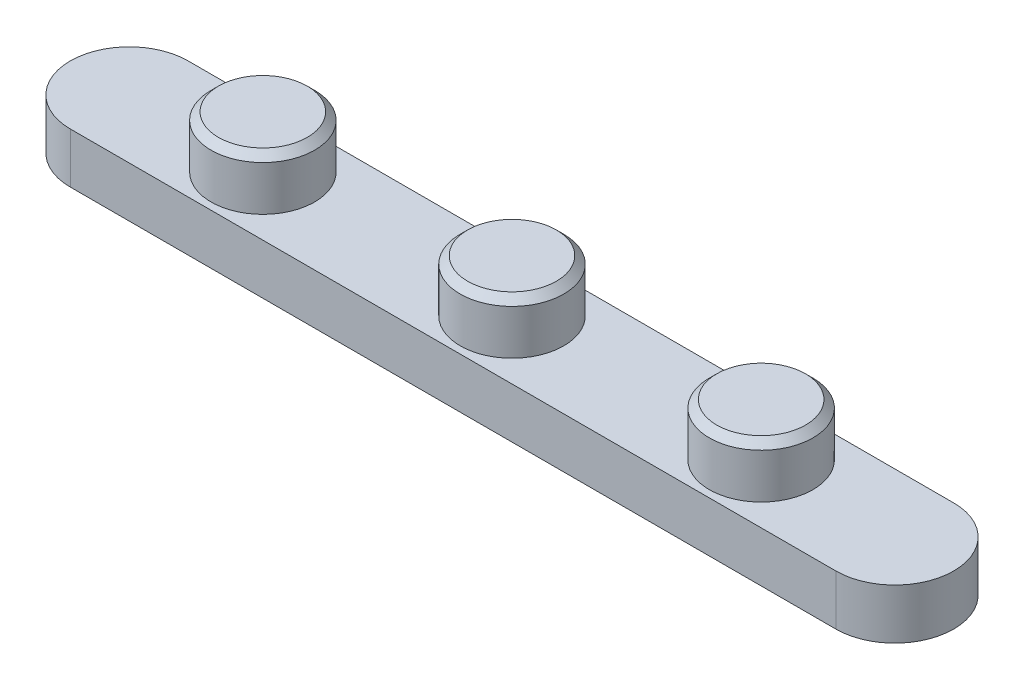
ISO-10303-21;
HEADER;
FILE_DESCRIPTION(('STEP AP214'),'2;1');
FILE_NAME('part.step','',(''),(''),'','','');
FILE_SCHEMA(('AUTOMOTIVE_DESIGN { 1 0 10303 214 1 1 1 1 }'));
ENDSEC;
DATA;
#1=APPLICATION_CONTEXT('core data for automotive mechanical design processes');
#2=APPLICATION_PROTOCOL_DEFINITION('international standard','automotive_design',2000,#1);
#3=PRODUCT_CONTEXT('',#1,'mechanical');
#4=PRODUCT('Part','Part','',(#3));
#5=PRODUCT_RELATED_PRODUCT_CATEGORY('part','',(#4));
#6=PRODUCT_DEFINITION_FORMATION('','',#4);
#7=PRODUCT_DEFINITION_CONTEXT('part definition',#1,'design');
#8=PRODUCT_DEFINITION('design','',#6,#7);
#9=PRODUCT_DEFINITION_SHAPE('','',#8);
#10=(LENGTH_UNIT() NAMED_UNIT(*) SI_UNIT(.MILLI.,.METRE.));
#11=(NAMED_UNIT(*) PLANE_ANGLE_UNIT() SI_UNIT($,.RADIAN.));
#12=(NAMED_UNIT(*) SI_UNIT($,.STERADIAN.) SOLID_ANGLE_UNIT());
#13=UNCERTAINTY_MEASURE_WITH_UNIT(LENGTH_MEASURE(1.E-05),#10,'distance_accuracy_value','');
#14=(GEOMETRIC_REPRESENTATION_CONTEXT(3) GLOBAL_UNCERTAINTY_ASSIGNED_CONTEXT((#13)) GLOBAL_UNIT_ASSIGNED_CONTEXT((#10,
#11,#12)) REPRESENTATION_CONTEXT('',''));
#15=CARTESIAN_POINT('',(0.,0.,0.));
#16=DIRECTION('',(0.,0.,1.));
#17=DIRECTION('',(1.,0.,0.));
#18=AXIS2_PLACEMENT_3D('',#15,#16,#17);
#19=CARTESIAN_POINT('',(-25.855,3.4,2.35888997018641E-13));
#20=DIRECTION('',(0.,-1.,0.));
#21=DIRECTION('',(0.,0.,-1.));
#22=AXIS2_PLACEMENT_3D('',#19,#20,#21);
#23=CYLINDRICAL_SURFACE('',#22,3.98000000000024);
#24=CARTESIAN_POINT('',(-25.855,0.,2.35888997018641E-13));
#25=DIRECTION('',(0.,1.,0.));
#26=DIRECTION('',(0.,0.,1.));
#27=AXIS2_PLACEMENT_3D('',#24,#25,#26);
#28=CIRCLE('',#27,3.98000000000024);
#29=CARTESIAN_POINT('',(-25.855,0.,-3.98000000000024));
#30=VERTEX_POINT('',#29);
#31=CARTESIAN_POINT('',(-25.855,0.,3.98000000000024));
#32=VERTEX_POINT('',#31);
#33=EDGE_CURVE('E114',#30,#32,#28,.T.);
#34=ORIENTED_EDGE('',*,*,#33,.T.);
#35=DIRECTION('',(0.,-1.,0.));
#36=VECTOR('',#35,1.);
#37=CARTESIAN_POINT('',(-25.855,3.4,3.98000000000024));
#38=LINE('',#37,#36);
#39=CARTESIAN_POINT('',(-25.855,3.4,3.98000000000024));
#40=VERTEX_POINT('',#39);
#41=EDGE_CURVE('E106',#40,#32,#38,.T.);
#42=ORIENTED_EDGE('',*,*,#41,.F.);
#43=CARTESIAN_POINT('',(-25.855,3.4,2.35888997018641E-13));
#44=DIRECTION('',(0.,1.,0.));
#45=DIRECTION('',(0.,0.,1.));
#46=AXIS2_PLACEMENT_3D('',#43,#44,#45);
#47=CIRCLE('',#46,3.98000000000024);
#48=CARTESIAN_POINT('',(-25.855,3.4,-3.98000000000024));
#49=VERTEX_POINT('',#48);
#50=EDGE_CURVE('E97',#49,#40,#47,.T.);
#51=ORIENTED_EDGE('',*,*,#50,.F.);
#52=DIRECTION('',(0.,-1.,0.));
#53=VECTOR('',#52,1.);
#54=CARTESIAN_POINT('',(-25.855,3.4,-3.98000000000024));
#55=LINE('',#54,#53);
#56=EDGE_CURVE('E63',#49,#30,#55,.T.);
#57=ORIENTED_EDGE('',*,*,#56,.T.);
#58=EDGE_LOOP('',(#34,#42,#51,#57));
#59=FACE_BOUND('',#58,.T.);
#60=ADVANCED_FACE('F45',(#59),#23,.T.);
#61=CARTESIAN_POINT('',(-25.855,3.4,3.98000000000024));
#62=DIRECTION('',(0.,0.,-1.));
#63=DIRECTION('',(-1.,0.,0.));
#64=AXIS2_PLACEMENT_3D('',#61,#62,#63);
#65=PLANE('',#64);
#66=DIRECTION('',(1.,0.,0.));
#67=VECTOR('',#66,1.);
#68=CARTESIAN_POINT('',(-25.855,0.,3.98000000000024));
#69=LINE('',#68,#67);
#70=CARTESIAN_POINT('',(25.855,0.,3.98000000000024));
#71=VERTEX_POINT('',#70);
#72=EDGE_CURVE('E103',#32,#71,#69,.T.);
#73=ORIENTED_EDGE('',*,*,#72,.T.);
#74=DIRECTION('',(0.,-1.,0.));
#75=VECTOR('',#74,1.);
#76=CARTESIAN_POINT('',(25.855,3.4,3.98000000000024));
#77=LINE('',#76,#75);
#78=CARTESIAN_POINT('',(25.855,3.4,3.98000000000024));
#79=VERTEX_POINT('',#78);
#80=EDGE_CURVE('E101',#79,#71,#77,.T.);
#81=ORIENTED_EDGE('',*,*,#80,.F.);
#82=DIRECTION('',(1.,0.,0.));
#83=VECTOR('',#82,1.);
#84=CARTESIAN_POINT('',(-25.855,3.4,3.98000000000024));
#85=LINE('',#84,#83);
#86=EDGE_CURVE('E90',#40,#79,#85,.T.);
#87=ORIENTED_EDGE('',*,*,#86,.F.);
#88=ORIENTED_EDGE('',*,*,#41,.T.);
#89=EDGE_LOOP('',(#73,#81,#87,#88));
#90=FACE_BOUND('',#89,.T.);
#91=ADVANCED_FACE('F102',(#90),#65,.F.);
#92=CARTESIAN_POINT('',(25.855,3.4,2.35888997018641E-13));
#93=DIRECTION('',(0.,-1.,0.));
#94=DIRECTION('',(0.,0.,-1.));
#95=AXIS2_PLACEMENT_3D('',#92,#93,#94);
#96=CYLINDRICAL_SURFACE('',#95,3.98000000000024);
#97=CARTESIAN_POINT('',(25.855,0.,2.35888997018641E-13));
#98=DIRECTION('',(0.,1.,0.));
#99=DIRECTION('',(0.,0.,1.));
#100=AXIS2_PLACEMENT_3D('',#97,#98,#99);
#101=CIRCLE('',#100,3.98000000000024);
#102=CARTESIAN_POINT('',(25.855,0.,-3.98));
#103=VERTEX_POINT('',#102);
#104=EDGE_CURVE('E118',#71,#103,#101,.T.);
#105=ORIENTED_EDGE('',*,*,#104,.T.);
#106=DIRECTION('',(0.,-1.,0.));
#107=VECTOR('',#106,1.);
#108=CARTESIAN_POINT('',(25.855,3.4,-3.98));
#109=LINE('',#108,#107);
#110=CARTESIAN_POINT('',(25.855,3.4,-3.98));
#111=VERTEX_POINT('',#110);
#112=EDGE_CURVE('E78',#111,#103,#109,.T.);
#113=ORIENTED_EDGE('',*,*,#112,.F.);
#114=CARTESIAN_POINT('',(25.855,3.4,2.35888997018641E-13));
#115=DIRECTION('',(0.,1.,0.));
#116=DIRECTION('',(0.,0.,1.));
#117=AXIS2_PLACEMENT_3D('',#114,#115,#116);
#118=CIRCLE('',#117,3.98000000000024);
#119=EDGE_CURVE('E96',#79,#111,#118,.T.);
#120=ORIENTED_EDGE('',*,*,#119,.F.);
#121=ORIENTED_EDGE('',*,*,#80,.T.);
#122=EDGE_LOOP('',(#105,#113,#120,#121));
#123=FACE_BOUND('',#122,.T.);
#124=ADVANCED_FACE('F108',(#123),#96,.T.);
#125=CARTESIAN_POINT('',(-25.855,3.4,-3.98000000000024));
#126=DIRECTION('',(0.,0.,-1.));
#127=DIRECTION('',(-1.,0.,0.));
#128=AXIS2_PLACEMENT_3D('',#125,#126,#127);
#129=PLANE('',#128);
#130=DIRECTION('',(1.,0.,0.));
#131=VECTOR('',#130,1.);
#132=CARTESIAN_POINT('',(-25.855,0.,-3.98000000000024));
#133=LINE('',#132,#131);
#134=EDGE_CURVE('E120',#30,#103,#133,.T.);
#135=ORIENTED_EDGE('',*,*,#134,.F.);
#136=ORIENTED_EDGE('',*,*,#56,.F.);
#137=DIRECTION('',(1.,0.,0.));
#138=VECTOR('',#137,1.);
#139=CARTESIAN_POINT('',(-25.855,3.4,-3.98000000000024));
#140=LINE('',#139,#138);
#141=EDGE_CURVE('E109',#49,#111,#140,.T.);
#142=ORIENTED_EDGE('',*,*,#141,.T.);
#143=ORIENTED_EDGE('',*,*,#112,.T.);
#144=EDGE_LOOP('',(#135,#136,#142,#143));
#145=FACE_BOUND('',#144,.T.);
#146=ADVANCED_FACE('F198',(#145),#129,.T.);
#147=CARTESIAN_POINT('',(-25.855,3.4,2.35888997018641E-13));
#148=DIRECTION('',(0.,1.,0.));
#149=DIRECTION('',(0.,0.,1.));
#150=AXIS2_PLACEMENT_3D('',#147,#148,#149);
#151=PLANE('',#150);
#152=CARTESIAN_POINT('',(0.,3.4,0.));
#153=DIRECTION('',(0.,1.,0.));
#154=DIRECTION('',(0.,0.,1.));
#155=AXIS2_PLACEMENT_3D('',#152,#153,#154);
#156=CIRCLE('',#155,3.5);
#157=CARTESIAN_POINT('',(0.,3.4,-3.5));
#158=VERTEX_POINT('',#157);
#159=EDGE_CURVE('E333',#158,#158,#156,.F.);
#160=ORIENTED_EDGE('',*,*,#159,.T.);
#161=EDGE_LOOP('',(#160));
#162=FACE_BOUND('',#161,.T.);
#163=CARTESIAN_POINT('',(16.8275,3.4,0.));
#164=DIRECTION('',(0.,1.,0.));
#165=DIRECTION('',(0.,0.,1.));
#166=AXIS2_PLACEMENT_3D('',#163,#164,#165);
#167=CIRCLE('',#166,3.5);
#168=CARTESIAN_POINT('',(16.8275,3.4,-3.5));
#169=VERTEX_POINT('',#168);
#170=EDGE_CURVE('E330',#169,#169,#167,.F.);
#171=ORIENTED_EDGE('',*,*,#170,.T.);
#172=EDGE_LOOP('',(#171));
#173=FACE_BOUND('',#172,.T.);
#174=CARTESIAN_POINT('',(-16.8275,3.4,0.));
#175=DIRECTION('',(0.,1.,0.));
#176=DIRECTION('',(0.,0.,1.));
#177=AXIS2_PLACEMENT_3D('',#174,#175,#176);
#178=CIRCLE('',#177,3.5);
#179=CARTESIAN_POINT('',(-16.8275,3.4,-3.5));
#180=VERTEX_POINT('',#179);
#181=EDGE_CURVE('E116',#180,#180,#178,.F.);
#182=ORIENTED_EDGE('',*,*,#181,.T.);
#183=EDGE_LOOP('',(#182));
#184=FACE_BOUND('',#183,.T.);
#185=ORIENTED_EDGE('',*,*,#50,.T.);
#186=ORIENTED_EDGE('',*,*,#86,.T.);
#187=ORIENTED_EDGE('',*,*,#119,.T.);
#188=ORIENTED_EDGE('',*,*,#141,.F.);
#189=EDGE_LOOP('',(#185,#186,#187,#188));
#190=FACE_BOUND('',#189,.T.);
#191=ADVANCED_FACE('F93',(#162,#173,#184,#190),#151,.T.);
#192=CARTESIAN_POINT('',(-25.855,0.,2.35888997018641E-13));
#193=DIRECTION('',(0.,1.,0.));
#194=DIRECTION('',(0.,0.,1.));
#195=AXIS2_PLACEMENT_3D('',#192,#193,#194);
#196=PLANE('',#195);
#197=ORIENTED_EDGE('',*,*,#33,.F.);
#198=ORIENTED_EDGE('',*,*,#134,.T.);
#199=ORIENTED_EDGE('',*,*,#104,.F.);
#200=ORIENTED_EDGE('',*,*,#72,.F.);
#201=EDGE_LOOP('',(#197,#198,#199,#200));
#202=FACE_BOUND('',#201,.T.);
#203=ADVANCED_FACE('F191',(#202),#196,.F.);
#204=CARTESIAN_POINT('',(-16.8275,6.93,0.));
#205=DIRECTION('',(0.,-1.,0.));
#206=DIRECTION('',(0.,0.,-1.));
#207=AXIS2_PLACEMENT_3D('',#204,#205,#206);
#208=CYLINDRICAL_SURFACE('',#207,3.5);
#209=CARTESIAN_POINT('',(-16.8275,6.43000000000003,0.));
#210=DIRECTION('',(0.,1.,0.));
#211=DIRECTION('',(0.,0.,1.));
#212=AXIS2_PLACEMENT_3D('',#209,#210,#211);
#213=CIRCLE('',#212,3.5);
#214=CARTESIAN_POINT('',(-16.8275,6.43000000000003,-3.5));
#215=VERTEX_POINT('',#214);
#216=EDGE_CURVE('E135',#215,#215,#213,.F.);
#217=CARTESIAN_POINT('',(-16.8275,6.43000000000003,-3.5));
#218=CARTESIAN_POINT('',(-16.8275,6.39843750000003,-3.5));
#219=CARTESIAN_POINT('',(-16.8275,6.36687500000003,-3.5));
#220=CARTESIAN_POINT('',(-16.8275,6.30375000000003,-3.5));
#221=CARTESIAN_POINT('',(-16.8275,6.27218750000003,-3.5));
#222=CARTESIAN_POINT('',(-16.8275,6.20906250000003,-3.5));
#223=CARTESIAN_POINT('',(-16.8275,6.17750000000003,-3.5));
#224=CARTESIAN_POINT('',(-16.8275,6.11437500000002,-3.5));
#225=CARTESIAN_POINT('',(-16.8275,6.08281250000002,-3.5));
#226=CARTESIAN_POINT('',(-16.8275,6.01968750000002,-3.5));
#227=CARTESIAN_POINT('',(-16.8275,5.98812500000002,-3.5));
#228=CARTESIAN_POINT('',(-16.8275,5.92500000000002,-3.5));
#229=CARTESIAN_POINT('',(-16.8275,5.89343750000002,-3.5));
#230=CARTESIAN_POINT('',(-16.8275,5.83031250000002,-3.5));
#231=CARTESIAN_POINT('',(-16.8275,5.79875000000002,-3.5));
#232=CARTESIAN_POINT('',(-16.8275,5.73562500000002,-3.5));
#233=CARTESIAN_POINT('',(-16.8275,5.70406250000002,-3.5));
#234=CARTESIAN_POINT('',(-16.8275,5.64093750000002,-3.5));
#235=CARTESIAN_POINT('',(-16.8275,5.60937500000002,-3.5));
#236=CARTESIAN_POINT('',(-16.8275,5.54625000000002,-3.5));
#237=CARTESIAN_POINT('',(-16.8275,5.51468750000002,-3.5));
#238=CARTESIAN_POINT('',(-16.8275,5.45156250000002,-3.5));
#239=CARTESIAN_POINT('',(-16.8275,5.42000000000002,-3.5));
#240=CARTESIAN_POINT('',(-16.8275,5.35687500000002,-3.5));
#241=CARTESIAN_POINT('',(-16.8275,5.32531250000002,-3.5));
#242=CARTESIAN_POINT('',(-16.8275,5.26218750000002,-3.5));
#243=CARTESIAN_POINT('',(-16.8275,5.23062500000002,-3.5));
#244=CARTESIAN_POINT('',(-16.8275,5.16750000000002,-3.5));
#245=CARTESIAN_POINT('',(-16.8275,5.13593750000002,-3.5));
#246=CARTESIAN_POINT('',(-16.8275,5.07281250000001,-3.5));
#247=CARTESIAN_POINT('',(-16.8275,5.04125000000001,-3.5));
#248=CARTESIAN_POINT('',(-16.8275,4.97812500000001,-3.5));
#249=CARTESIAN_POINT('',(-16.8275,4.94656250000001,-3.5));
#250=CARTESIAN_POINT('',(-16.8275,4.88343750000001,-3.5));
#251=CARTESIAN_POINT('',(-16.8275,4.85187500000001,-3.5));
#252=CARTESIAN_POINT('',(-16.8275,4.78875000000001,-3.5));
#253=CARTESIAN_POINT('',(-16.8275,4.75718750000001,-3.5));
#254=CARTESIAN_POINT('',(-16.8275,4.69406250000001,-3.5));
#255=CARTESIAN_POINT('',(-16.8275,4.66250000000001,-3.5));
#256=CARTESIAN_POINT('',(-16.8275,4.59937500000001,-3.5));
#257=CARTESIAN_POINT('',(-16.8275,4.56781250000001,-3.5));
#258=CARTESIAN_POINT('',(-16.8275,4.50468750000001,-3.5));
#259=CARTESIAN_POINT('',(-16.8275,4.47312500000001,-3.5));
#260=CARTESIAN_POINT('',(-16.8275,4.41000000000001,-3.5));
#261=CARTESIAN_POINT('',(-16.8275,4.37843750000001,-3.5));
#262=CARTESIAN_POINT('',(-16.8275,4.31531250000001,-3.5));
#263=CARTESIAN_POINT('',(-16.8275,4.28375000000001,-3.5));
#264=CARTESIAN_POINT('',(-16.8275,4.22062500000001,-3.5));
#265=CARTESIAN_POINT('',(-16.8275,4.18906250000001,-3.5));
#266=CARTESIAN_POINT('',(-16.8275,4.12593750000001,-3.5));
#267=CARTESIAN_POINT('',(-16.8275,4.09437500000001,-3.5));
#268=CARTESIAN_POINT('',(-16.8275,4.03125000000001,-3.5));
#269=CARTESIAN_POINT('',(-16.8275,3.99968750000001,-3.5));
#270=CARTESIAN_POINT('',(-16.8275,3.9365625,-3.5));
#271=CARTESIAN_POINT('',(-16.8275,3.905,-3.5));
#272=CARTESIAN_POINT('',(-16.8275,3.841875,-3.5));
#273=CARTESIAN_POINT('',(-16.8275,3.8103125,-3.5));
#274=CARTESIAN_POINT('',(-16.8275,3.7471875,-3.5));
#275=CARTESIAN_POINT('',(-16.8275,3.715625,-3.5));
#276=CARTESIAN_POINT('',(-16.8275,3.6525,-3.5));
#277=CARTESIAN_POINT('',(-16.8275,3.6209375,-3.5));
#278=CARTESIAN_POINT('',(-16.8275,3.5578125,-3.5));
#279=CARTESIAN_POINT('',(-16.8275,3.52625,-3.5));
#280=CARTESIAN_POINT('',(-16.8275,3.463125,-3.5));
#281=CARTESIAN_POINT('',(-16.8275,3.4315625,-3.5));
#282=CARTESIAN_POINT('',(-16.8275,3.4,-3.5));
#283=B_SPLINE_CURVE_WITH_KNOTS('',3,(#217,#218,#219,#220,#221,#222,#223,#224,#225,#226,#227,
#228,#229,#230,#231,#232,#233,#234,#235,#236,#237,#238,#239,#240,#241,#242,#243,#244,#245,#246,
#247,#248,#249,#250,#251,#252,#253,#254,#255,#256,#257,#258,#259,#260,#261,#262,#263,#264,#265,
#266,#267,#268,#269,#270,#271,#272,#273,#274,#275,#276,#277,#278,#279,#280,#281,#282),
.UNSPECIFIED.,.F.,.F.,(4,2,2,2,2,2,2,2,2,2,2,2,2,2,2,2,2,2,2,2,2,2,2,2,2,2,2,2,2,2,2,2,4),(0.,
0.0946875000000001,0.189375000000001,0.284062500000002,0.378750000000003,0.473437500000004,
0.568125000000004,0.662812500000005,0.757500000000006,0.852187500000007,0.946875000000008,
1.04156250000001,1.13625000000001,1.23093750000001,1.32562500000001,1.42031250000001,
1.51500000000001,1.60968750000001,1.70437500000001,1.79906250000002,1.89375000000002,
1.98843750000002,2.08312500000002,2.17781250000002,2.27250000000002,2.36718750000002,
2.46187500000002,2.55656250000002,2.65125000000002,2.74593750000002,2.84062500000003,
2.93531250000003,3.03000000000003),.UNSPECIFIED.);
#284=EDGE_CURVE('BSEAM183',#215,#180,#283,.T.);
#285=ORIENTED_EDGE('',*,*,#216,.T.);
#286=ORIENTED_EDGE('',*,*,#181,.F.);
#287=ORIENTED_EDGE('',*,*,#284,.T.);
#288=ORIENTED_EDGE('',*,*,#284,.F.);
#289=EDGE_LOOP('',(#285,#287,#286,#288));
#290=FACE_BOUND('',#289,.T.);
#291=ADVANCED_FACE('F183',(#290),#208,.T.);
#292=CARTESIAN_POINT('',(0.,6.93,0.));
#293=DIRECTION('',(0.,1.,0.));
#294=DIRECTION('',(0.,0.,1.));
#295=AXIS2_PLACEMENT_3D('',#292,#293,#294);
#296=PLANE('',#295);
#297=CARTESIAN_POINT('',(-16.8275,6.93,0.));
#298=DIRECTION('',(0.,1.,0.));
#299=DIRECTION('',(0.,0.,1.));
#300=AXIS2_PLACEMENT_3D('',#297,#298,#299);
#301=CIRCLE('',#300,3.00000000000003);
#302=CARTESIAN_POINT('',(-16.8275,6.93,3.00000000000003));
#303=VERTEX_POINT('',#302);
#304=EDGE_CURVE('E132',#303,#303,#301,.T.);
#305=ORIENTED_EDGE('',*,*,#304,.T.);
#306=EDGE_LOOP('',(#305));
#307=FACE_BOUND('',#306,.T.);
#308=ADVANCED_FACE('F180',(#307),#296,.T.);
#309=CARTESIAN_POINT('',(16.8275,6.93,0.));
#310=DIRECTION('',(0.,-1.,0.));
#311=DIRECTION('',(0.,0.,-1.));
#312=AXIS2_PLACEMENT_3D('',#309,#310,#311);
#313=CYLINDRICAL_SURFACE('',#312,3.5);
#314=CARTESIAN_POINT('',(16.8275,6.43000000000003,0.));
#315=DIRECTION('',(0.,1.,0.));
#316=DIRECTION('',(0.,0.,1.));
#317=AXIS2_PLACEMENT_3D('',#314,#315,#316);
#318=CIRCLE('',#317,3.5);
#319=CARTESIAN_POINT('',(16.8275,6.43000000000003,-3.5));
#320=VERTEX_POINT('',#319);
#321=EDGE_CURVE('E129',#320,#320,#318,.F.);
#322=CARTESIAN_POINT('',(16.8275,6.43000000000003,-3.5));
#323=CARTESIAN_POINT('',(16.8275,6.39843750000003,-3.5));
#324=CARTESIAN_POINT('',(16.8275,6.36687500000003,-3.5));
#325=CARTESIAN_POINT('',(16.8275,6.30375000000003,-3.5));
#326=CARTESIAN_POINT('',(16.8275,6.27218750000003,-3.5));
#327=CARTESIAN_POINT('',(16.8275,6.20906250000003,-3.5));
#328=CARTESIAN_POINT('',(16.8275,6.17750000000003,-3.5));
#329=CARTESIAN_POINT('',(16.8275,6.11437500000002,-3.5));
#330=CARTESIAN_POINT('',(16.8275,6.08281250000002,-3.5));
#331=CARTESIAN_POINT('',(16.8275,6.01968750000002,-3.5));
#332=CARTESIAN_POINT('',(16.8275,5.98812500000002,-3.5));
#333=CARTESIAN_POINT('',(16.8275,5.92500000000002,-3.5));
#334=CARTESIAN_POINT('',(16.8275,5.89343750000002,-3.5));
#335=CARTESIAN_POINT('',(16.8275,5.83031250000002,-3.5));
#336=CARTESIAN_POINT('',(16.8275,5.79875000000002,-3.5));
#337=CARTESIAN_POINT('',(16.8275,5.73562500000002,-3.5));
#338=CARTESIAN_POINT('',(16.8275,5.70406250000002,-3.5));
#339=CARTESIAN_POINT('',(16.8275,5.64093750000002,-3.5));
#340=CARTESIAN_POINT('',(16.8275,5.60937500000002,-3.5));
#341=CARTESIAN_POINT('',(16.8275,5.54625000000002,-3.5));
#342=CARTESIAN_POINT('',(16.8275,5.51468750000002,-3.5));
#343=CARTESIAN_POINT('',(16.8275,5.45156250000002,-3.5));
#344=CARTESIAN_POINT('',(16.8275,5.42000000000002,-3.5));
#345=CARTESIAN_POINT('',(16.8275,5.35687500000002,-3.5));
#346=CARTESIAN_POINT('',(16.8275,5.32531250000002,-3.5));
#347=CARTESIAN_POINT('',(16.8275,5.26218750000002,-3.5));
#348=CARTESIAN_POINT('',(16.8275,5.23062500000002,-3.5));
#349=CARTESIAN_POINT('',(16.8275,5.16750000000002,-3.5));
#350=CARTESIAN_POINT('',(16.8275,5.13593750000002,-3.5));
#351=CARTESIAN_POINT('',(16.8275,5.07281250000001,-3.5));
#352=CARTESIAN_POINT('',(16.8275,5.04125000000001,-3.5));
#353=CARTESIAN_POINT('',(16.8275,4.97812500000001,-3.5));
#354=CARTESIAN_POINT('',(16.8275,4.94656250000001,-3.5));
#355=CARTESIAN_POINT('',(16.8275,4.88343750000001,-3.5));
#356=CARTESIAN_POINT('',(16.8275,4.85187500000001,-3.5));
#357=CARTESIAN_POINT('',(16.8275,4.78875000000001,-3.5));
#358=CARTESIAN_POINT('',(16.8275,4.75718750000001,-3.5));
#359=CARTESIAN_POINT('',(16.8275,4.69406250000001,-3.5));
#360=CARTESIAN_POINT('',(16.8275,4.66250000000001,-3.5));
#361=CARTESIAN_POINT('',(16.8275,4.59937500000001,-3.5));
#362=CARTESIAN_POINT('',(16.8275,4.56781250000001,-3.5));
#363=CARTESIAN_POINT('',(16.8275,4.50468750000001,-3.5));
#364=CARTESIAN_POINT('',(16.8275,4.47312500000001,-3.5));
#365=CARTESIAN_POINT('',(16.8275,4.41000000000001,-3.5));
#366=CARTESIAN_POINT('',(16.8275,4.37843750000001,-3.5));
#367=CARTESIAN_POINT('',(16.8275,4.31531250000001,-3.5));
#368=CARTESIAN_POINT('',(16.8275,4.28375000000001,-3.5));
#369=CARTESIAN_POINT('',(16.8275,4.22062500000001,-3.5));
#370=CARTESIAN_POINT('',(16.8275,4.18906250000001,-3.5));
#371=CARTESIAN_POINT('',(16.8275,4.12593750000001,-3.5));
#372=CARTESIAN_POINT('',(16.8275,4.09437500000001,-3.5));
#373=CARTESIAN_POINT('',(16.8275,4.03125000000001,-3.5));
#374=CARTESIAN_POINT('',(16.8275,3.99968750000001,-3.5));
#375=CARTESIAN_POINT('',(16.8275,3.9365625,-3.5));
#376=CARTESIAN_POINT('',(16.8275,3.905,-3.5));
#377=CARTESIAN_POINT('',(16.8275,3.841875,-3.5));
#378=CARTESIAN_POINT('',(16.8275,3.8103125,-3.5));
#379=CARTESIAN_POINT('',(16.8275,3.7471875,-3.5));
#380=CARTESIAN_POINT('',(16.8275,3.715625,-3.5));
#381=CARTESIAN_POINT('',(16.8275,3.6525,-3.5));
#382=CARTESIAN_POINT('',(16.8275,3.6209375,-3.5));
#383=CARTESIAN_POINT('',(16.8275,3.5578125,-3.5));
#384=CARTESIAN_POINT('',(16.8275,3.52625,-3.5));
#385=CARTESIAN_POINT('',(16.8275,3.463125,-3.5));
#386=CARTESIAN_POINT('',(16.8275,3.4315625,-3.5));
#387=CARTESIAN_POINT('',(16.8275,3.4,-3.5));
#388=B_SPLINE_CURVE_WITH_KNOTS('',3,(#322,#323,#324,#325,#326,#327,#328,#329,#330,#331,#332,
#333,#334,#335,#336,#337,#338,#339,#340,#341,#342,#343,#344,#345,#346,#347,#348,#349,#350,#351,
#352,#353,#354,#355,#356,#357,#358,#359,#360,#361,#362,#363,#364,#365,#366,#367,#368,#369,#370,
#371,#372,#373,#374,#375,#376,#377,#378,#379,#380,#381,#382,#383,#384,#385,#386,#387),
.UNSPECIFIED.,.F.,.F.,(4,2,2,2,2,2,2,2,2,2,2,2,2,2,2,2,2,2,2,2,2,2,2,2,2,2,2,2,2,2,2,2,4),(0.,
0.0946875000000001,0.189375000000001,0.284062500000002,0.378750000000003,0.473437500000004,
0.568125000000004,0.662812500000005,0.757500000000006,0.852187500000007,0.946875000000008,
1.04156250000001,1.13625000000001,1.23093750000001,1.32562500000001,1.42031250000001,
1.51500000000001,1.60968750000001,1.70437500000001,1.79906250000002,1.89375000000002,
1.98843750000002,2.08312500000002,2.17781250000002,2.27250000000002,2.36718750000002,
2.46187500000002,2.55656250000002,2.65125000000002,2.74593750000002,2.84062500000003,
2.93531250000003,3.03000000000003),.UNSPECIFIED.);
#389=EDGE_CURVE('BSEAM182',#320,#169,#388,.T.);
#390=ORIENTED_EDGE('',*,*,#321,.T.);
#391=ORIENTED_EDGE('',*,*,#170,.F.);
#392=ORIENTED_EDGE('',*,*,#389,.T.);
#393=ORIENTED_EDGE('',*,*,#389,.F.);
#394=EDGE_LOOP('',(#390,#392,#391,#393));
#395=FACE_BOUND('',#394,.T.);
#396=ADVANCED_FACE('F182',(#395),#313,.T.);
#397=CARTESIAN_POINT('',(0.,6.93,0.));
#398=DIRECTION('',(0.,1.,0.));
#399=DIRECTION('',(0.,0.,1.));
#400=AXIS2_PLACEMENT_3D('',#397,#398,#399);
#401=PLANE('',#400);
#402=CARTESIAN_POINT('',(16.8275,6.93,0.));
#403=DIRECTION('',(0.,1.,0.));
#404=DIRECTION('',(0.,0.,1.));
#405=AXIS2_PLACEMENT_3D('',#402,#403,#404);
#406=CIRCLE('',#405,3.00000000000003);
#407=CARTESIAN_POINT('',(16.8275,6.93,3.00000000000003));
#408=VERTEX_POINT('',#407);
#409=EDGE_CURVE('E126',#408,#408,#406,.T.);
#410=ORIENTED_EDGE('',*,*,#409,.T.);
#411=EDGE_LOOP('',(#410));
#412=FACE_BOUND('',#411,.T.);
#413=ADVANCED_FACE('F165',(#412),#401,.T.);
#414=CARTESIAN_POINT('',(16.8275,6.93,0.));
#415=DIRECTION('',(0.,-1.,0.));
#416=DIRECTION('',(0.,0.,-1.));
#417=AXIS2_PLACEMENT_3D('',#414,#415,#416);
#418=CONICAL_SURFACE('',#417,3.00000000000003,0.78539816339745);
#419=ORIENTED_EDGE('',*,*,#321,.F.);
#420=EDGE_LOOP('',(#419));
#421=FACE_BOUND('',#420,.T.);
#422=ORIENTED_EDGE('',*,*,#409,.F.);
#423=EDGE_LOOP('',(#422));
#424=FACE_BOUND('',#423,.T.);
#425=ADVANCED_FACE('F159',(#421,#424),#418,.T.);
#426=CARTESIAN_POINT('',(-16.8275,6.93,0.));
#427=DIRECTION('',(0.,-1.,0.));
#428=DIRECTION('',(0.,0.,-1.));
#429=AXIS2_PLACEMENT_3D('',#426,#427,#428);
#430=CONICAL_SURFACE('',#429,3.00000000000003,0.78539816339745);
#431=ORIENTED_EDGE('',*,*,#216,.F.);
#432=EDGE_LOOP('',(#431));
#433=FACE_BOUND('',#432,.T.);
#434=ORIENTED_EDGE('',*,*,#304,.F.);
#435=EDGE_LOOP('',(#434));
#436=FACE_BOUND('',#435,.T.);
#437=ADVANCED_FACE('F164',(#433,#436),#430,.T.);
#438=CARTESIAN_POINT('',(0.,6.93,0.));
#439=DIRECTION('',(0.,-1.,0.));
#440=DIRECTION('',(0.,0.,-1.));
#441=AXIS2_PLACEMENT_3D('',#438,#439,#440);
#442=CYLINDRICAL_SURFACE('',#441,3.5);
#443=CARTESIAN_POINT('',(0.,6.43000000000003,0.));
#444=DIRECTION('',(0.,1.,0.));
#445=DIRECTION('',(0.,0.,1.));
#446=AXIS2_PLACEMENT_3D('',#443,#444,#445);
#447=CIRCLE('',#446,3.5);
#448=CARTESIAN_POINT('',(0.,6.43000000000003,-3.5));
#449=VERTEX_POINT('',#448);
#450=EDGE_CURVE('E11',#449,#449,#447,.F.);
#451=CARTESIAN_POINT('',(0.,6.43000000000003,-3.5));
#452=CARTESIAN_POINT('',(0.,6.39843750000003,-3.5));
#453=CARTESIAN_POINT('',(0.,6.36687500000003,-3.5));
#454=CARTESIAN_POINT('',(0.,6.30375000000003,-3.5));
#455=CARTESIAN_POINT('',(0.,6.27218750000003,-3.5));
#456=CARTESIAN_POINT('',(0.,6.20906250000002,-3.5));
#457=CARTESIAN_POINT('',(0.,6.17750000000002,-3.5));
#458=CARTESIAN_POINT('',(0.,6.11437500000002,-3.5));
#459=CARTESIAN_POINT('',(0.,6.08281250000002,-3.5));
#460=CARTESIAN_POINT('',(0.,6.01968750000002,-3.5));
#461=CARTESIAN_POINT('',(0.,5.98812500000002,-3.5));
#462=CARTESIAN_POINT('',(0.,5.92500000000002,-3.5));
#463=CARTESIAN_POINT('',(0.,5.89343750000002,-3.5));
#464=CARTESIAN_POINT('',(0.,5.83031250000002,-3.5));
#465=CARTESIAN_POINT('',(0.,5.79875000000002,-3.5));
#466=CARTESIAN_POINT('',(0.,5.73562500000002,-3.5));
#467=CARTESIAN_POINT('',(0.,5.70406250000002,-3.5));
#468=CARTESIAN_POINT('',(0.,5.64093750000002,-3.5));
#469=CARTESIAN_POINT('',(0.,5.60937500000002,-3.5));
#470=CARTESIAN_POINT('',(0.,5.54625000000002,-3.5));
#471=CARTESIAN_POINT('',(0.,5.51468750000002,-3.5));
#472=CARTESIAN_POINT('',(0.,5.45156250000002,-3.5));
#473=CARTESIAN_POINT('',(0.,5.42000000000002,-3.5));
#474=CARTESIAN_POINT('',(0.,5.35687500000002,-3.5));
#475=CARTESIAN_POINT('',(0.,5.32531250000002,-3.5));
#476=CARTESIAN_POINT('',(0.,5.26218750000002,-3.5));
#477=CARTESIAN_POINT('',(0.,5.23062500000002,-3.5));
#478=CARTESIAN_POINT('',(0.,5.16750000000002,-3.5));
#479=CARTESIAN_POINT('',(0.,5.13593750000002,-3.5));
#480=CARTESIAN_POINT('',(0.,5.07281250000001,-3.5));
#481=CARTESIAN_POINT('',(0.,5.04125000000001,-3.5));
#482=CARTESIAN_POINT('',(0.,4.97812500000001,-3.5));
#483=CARTESIAN_POINT('',(0.,4.94656250000001,-3.5));
#484=CARTESIAN_POINT('',(0.,4.88343750000001,-3.5));
#485=CARTESIAN_POINT('',(0.,4.85187500000001,-3.5));
#486=CARTESIAN_POINT('',(0.,4.78875000000001,-3.5));
#487=CARTESIAN_POINT('',(0.,4.75718750000001,-3.5));
#488=CARTESIAN_POINT('',(0.,4.69406250000001,-3.5));
#489=CARTESIAN_POINT('',(0.,4.66250000000001,-3.5));
#490=CARTESIAN_POINT('',(0.,4.59937500000001,-3.5));
#491=CARTESIAN_POINT('',(0.,4.56781250000001,-3.5));
#492=CARTESIAN_POINT('',(0.,4.50468750000001,-3.5));
#493=CARTESIAN_POINT('',(0.,4.47312500000001,-3.5));
#494=CARTESIAN_POINT('',(0.,4.41000000000001,-3.5));
#495=CARTESIAN_POINT('',(0.,4.37843750000001,-3.5));
#496=CARTESIAN_POINT('',(0.,4.31531250000001,-3.5));
#497=CARTESIAN_POINT('',(0.,4.28375000000001,-3.5));
#498=CARTESIAN_POINT('',(0.,4.22062500000001,-3.5));
#499=CARTESIAN_POINT('',(0.,4.18906250000001,-3.5));
#500=CARTESIAN_POINT('',(0.,4.12593750000001,-3.5));
#501=CARTESIAN_POINT('',(0.,4.09437500000001,-3.5));
#502=CARTESIAN_POINT('',(0.,4.03125000000001,-3.5));
#503=CARTESIAN_POINT('',(0.,3.99968750000001,-3.5));
#504=CARTESIAN_POINT('',(0.,3.9365625,-3.5));
#505=CARTESIAN_POINT('',(0.,3.905,-3.5));
#506=CARTESIAN_POINT('',(0.,3.841875,-3.5));
#507=CARTESIAN_POINT('',(0.,3.8103125,-3.5));
#508=CARTESIAN_POINT('',(0.,3.7471875,-3.5));
#509=CARTESIAN_POINT('',(0.,3.715625,-3.5));
#510=CARTESIAN_POINT('',(0.,3.6525,-3.5));
#511=CARTESIAN_POINT('',(0.,3.6209375,-3.5));
#512=CARTESIAN_POINT('',(0.,3.5578125,-3.5));
#513=CARTESIAN_POINT('',(0.,3.52625,-3.5));
#514=CARTESIAN_POINT('',(0.,3.463125,-3.5));
#515=CARTESIAN_POINT('',(0.,3.4315625,-3.5));
#516=CARTESIAN_POINT('',(0.,3.4,-3.5));
#517=B_SPLINE_CURVE_WITH_KNOTS('',3,(#451,#452,#453,#454,#455,#456,#457,#458,#459,#460,#461,
#462,#463,#464,#465,#466,#467,#468,#469,#470,#471,#472,#473,#474,#475,#476,#477,#478,#479,#480,
#481,#482,#483,#484,#485,#486,#487,#488,#489,#490,#491,#492,#493,#494,#495,#496,#497,#498,#499,
#500,#501,#502,#503,#504,#505,#506,#507,#508,#509,#510,#511,#512,#513,#514,#515,#516),
.UNSPECIFIED.,.F.,.F.,(4,2,2,2,2,2,2,2,2,2,2,2,2,2,2,2,2,2,2,2,2,2,2,2,2,2,2,2,2,2,2,2,4),(0.,
0.094687500000001,0.189375000000002,0.284062500000003,0.378750000000004,0.473437500000004,
0.568125000000005,0.662812500000006,0.757500000000007,0.852187500000007,0.946875000000008,
1.04156250000001,1.13625000000001,1.23093750000001,1.32562500000001,1.42031250000001,
1.51500000000001,1.60968750000001,1.70437500000002,1.79906250000002,1.89375000000002,
1.98843750000002,2.08312500000002,2.17781250000002,2.27250000000002,2.36718750000002,
2.46187500000002,2.55656250000002,2.65125000000002,2.74593750000002,2.84062500000003,
2.93531250000003,3.03000000000003),.UNSPECIFIED.);
#518=EDGE_CURVE('BSEAM147',#449,#158,#517,.T.);
#519=ORIENTED_EDGE('',*,*,#450,.T.);
#520=ORIENTED_EDGE('',*,*,#159,.F.);
#521=ORIENTED_EDGE('',*,*,#518,.T.);
#522=ORIENTED_EDGE('',*,*,#518,.F.);
#523=EDGE_LOOP('',(#519,#521,#520,#522));
#524=FACE_BOUND('',#523,.T.);
#525=ADVANCED_FACE('F147',(#524),#442,.T.);
#526=CARTESIAN_POINT('',(0.,6.93,0.));
#527=DIRECTION('',(0.,1.,0.));
#528=DIRECTION('',(0.,0.,1.));
#529=AXIS2_PLACEMENT_3D('',#526,#527,#528);
#530=PLANE('',#529);
#531=CARTESIAN_POINT('',(0.,6.93,0.));
#532=DIRECTION('',(0.,1.,0.));
#533=DIRECTION('',(0.,0.,1.));
#534=AXIS2_PLACEMENT_3D('',#531,#532,#533);
#535=CIRCLE('',#534,3.00000000000003);
#536=CARTESIAN_POINT('',(0.,6.93,3.00000000000003));
#537=VERTEX_POINT('',#536);
#538=EDGE_CURVE('E55',#537,#537,#535,.T.);
#539=ORIENTED_EDGE('',*,*,#538,.T.);
#540=EDGE_LOOP('',(#539));
#541=FACE_BOUND('',#540,.T.);
#542=ADVANCED_FACE('F140',(#541),#530,.T.);
#543=CARTESIAN_POINT('',(0.,6.93,0.));
#544=DIRECTION('',(0.,-1.,0.));
#545=DIRECTION('',(0.,0.,-1.));
#546=AXIS2_PLACEMENT_3D('',#543,#544,#545);
#547=CONICAL_SURFACE('',#546,3.00000000000003,0.785398163397449);
#548=ORIENTED_EDGE('',*,*,#450,.F.);
#549=EDGE_LOOP('',(#548));
#550=FACE_BOUND('',#549,.T.);
#551=ORIENTED_EDGE('',*,*,#538,.F.);
#552=EDGE_LOOP('',(#551));
#553=FACE_BOUND('',#552,.T.);
#554=ADVANCED_FACE('F48',(#550,#553),#547,.T.);
#555=CLOSED_SHELL('',(#60,#91,#124,#146,#191,#203,#291,#308,#396,#413,#425,#437,#525,#542,#554));
#556=MANIFOLD_SOLID_BREP('B2',#555);
#557=ADVANCED_BREP_SHAPE_REPRESENTATION('',(#18,#556),#14);
#558=SHAPE_DEFINITION_REPRESENTATION(#9,#557);
ENDSEC;
END-ISO-10303-21;
